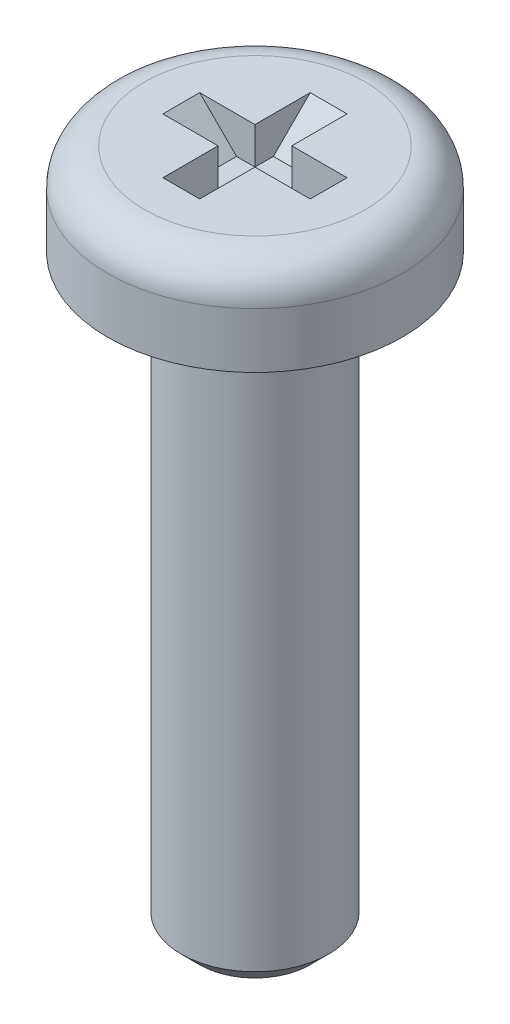
ISO-10303-21;
HEADER;
FILE_DESCRIPTION(('STEP AP214'),'2;1');
FILE_NAME('part.step','',(''),(''),'','','');
FILE_SCHEMA(('AUTOMOTIVE_DESIGN { 1 0 10303 214 1 1 1 1 }'));
ENDSEC;
DATA;
#1=APPLICATION_CONTEXT('core data for automotive mechanical design processes');
#2=APPLICATION_PROTOCOL_DEFINITION('international standard','automotive_design',2000,#1);
#3=PRODUCT_CONTEXT('',#1,'mechanical');
#4=PRODUCT('Part','Part','',(#3));
#5=PRODUCT_RELATED_PRODUCT_CATEGORY('part','',(#4));
#6=PRODUCT_DEFINITION_FORMATION('','',#4);
#7=PRODUCT_DEFINITION_CONTEXT('part definition',#1,'design');
#8=PRODUCT_DEFINITION('design','',#6,#7);
#9=PRODUCT_DEFINITION_SHAPE('','',#8);
#10=(LENGTH_UNIT() NAMED_UNIT(*) SI_UNIT(.MILLI.,.METRE.));
#11=(NAMED_UNIT(*) PLANE_ANGLE_UNIT() SI_UNIT($,.RADIAN.));
#12=(NAMED_UNIT(*) SI_UNIT($,.STERADIAN.) SOLID_ANGLE_UNIT());
#13=UNCERTAINTY_MEASURE_WITH_UNIT(LENGTH_MEASURE(1.E-05),#10,'distance_accuracy_value','');
#14=(GEOMETRIC_REPRESENTATION_CONTEXT(3) GLOBAL_UNCERTAINTY_ASSIGNED_CONTEXT((#13)) GLOBAL_UNIT_ASSIGNED_CONTEXT((#10,
#11,#12)) REPRESENTATION_CONTEXT('',''));
#15=CARTESIAN_POINT('',(0.,0.,0.));
#16=DIRECTION('',(0.,0.,1.));
#17=DIRECTION('',(1.,0.,0.));
#18=AXIS2_PLACEMENT_3D('',#15,#16,#17);
#19=CARTESIAN_POINT('',(0.,16.,0.));
#20=DIRECTION('',(0.,-1.,0.));
#21=DIRECTION('',(0.,0.,-1.));
#22=AXIS2_PLACEMENT_3D('',#19,#20,#21);
#23=CYLINDRICAL_SURFACE('',#22,2.);
#24=CARTESIAN_POINT('',(0.,0.500000000000002,0.));
#25=DIRECTION('',(0.,1.,0.));
#26=DIRECTION('',(0.,0.,1.));
#27=AXIS2_PLACEMENT_3D('',#24,#25,#26);
#28=CIRCLE('',#27,2.);
#29=CARTESIAN_POINT('',(0.,0.500000000000002,2.));
#30=VERTEX_POINT('',#29);
#31=EDGE_CURVE('E245',#30,#30,#28,.T.);
#32=ORIENTED_EDGE('',*,*,#31,.T.);
#33=EDGE_LOOP('',(#32));
#34=FACE_BOUND('',#33,.T.);
#35=CARTESIAN_POINT('',(0.,16.,0.));
#36=DIRECTION('',(0.,1.,0.));
#37=DIRECTION('',(0.,0.,1.));
#38=AXIS2_PLACEMENT_3D('',#35,#36,#37);
#39=CIRCLE('',#38,2.);
#40=CARTESIAN_POINT('',(0.,16.,2.));
#41=VERTEX_POINT('',#40);
#42=EDGE_CURVE('E231',#41,#41,#39,.T.);
#43=ORIENTED_EDGE('',*,*,#42,.F.);
#44=EDGE_LOOP('',(#43));
#45=FACE_BOUND('',#44,.T.);
#46=ADVANCED_FACE('F69',(#34,#45),#23,.T.);
#47=CARTESIAN_POINT('',(0.,0.,0.));
#48=DIRECTION('',(0.,1.,0.));
#49=DIRECTION('',(0.,0.,1.));
#50=AXIS2_PLACEMENT_3D('',#47,#48,#49);
#51=PLANE('',#50);
#52=CARTESIAN_POINT('',(0.,0.,0.));
#53=DIRECTION('',(0.,1.,0.));
#54=DIRECTION('',(0.,0.,1.));
#55=AXIS2_PLACEMENT_3D('',#52,#53,#54);
#56=CIRCLE('',#55,1.49999999999999);
#57=CARTESIAN_POINT('',(0.,0.,1.49999999999999));
#58=VERTEX_POINT('',#57);
#59=EDGE_CURVE('E241',#58,#58,#56,.F.);
#60=ORIENTED_EDGE('',*,*,#59,.T.);
#61=EDGE_LOOP('',(#60));
#62=FACE_BOUND('',#61,.T.);
#63=ADVANCED_FACE('F309',(#62),#51,.F.);
#64=CARTESIAN_POINT('',(0.,18.5,0.));
#65=DIRECTION('',(0.,-1.,0.));
#66=DIRECTION('',(0.,0.,-1.));
#67=AXIS2_PLACEMENT_3D('',#64,#65,#66);
#68=CYLINDRICAL_SURFACE('',#67,4.);
#69=CARTESIAN_POINT('',(0.,17.5,0.));
#70=DIRECTION('',(0.,1.,0.));
#71=DIRECTION('',(0.,0.,1.));
#72=AXIS2_PLACEMENT_3D('',#69,#70,#71);
#73=CIRCLE('',#72,4.);
#74=CARTESIAN_POINT('',(0.,17.5,4.));
#75=VERTEX_POINT('',#74);
#76=EDGE_CURVE('E239',#75,#75,#73,.F.);
#77=ORIENTED_EDGE('',*,*,#76,.T.);
#78=EDGE_LOOP('',(#77));
#79=FACE_BOUND('',#78,.T.);
#80=CARTESIAN_POINT('',(0.,16.,0.));
#81=DIRECTION('',(0.,1.,0.));
#82=DIRECTION('',(0.,0.,1.));
#83=AXIS2_PLACEMENT_3D('',#80,#81,#82);
#84=CIRCLE('',#83,4.);
#85=CARTESIAN_POINT('',(0.,16.,4.));
#86=VERTEX_POINT('',#85);
#87=EDGE_CURVE('E217',#86,#86,#84,.T.);
#88=ORIENTED_EDGE('',*,*,#87,.T.);
#89=EDGE_LOOP('',(#88));
#90=FACE_BOUND('',#89,.T.);
#91=ADVANCED_FACE('F316',(#79,#90),#68,.T.);
#92=CARTESIAN_POINT('',(0.,18.5,0.));
#93=DIRECTION('',(0.,1.,0.));
#94=DIRECTION('',(0.,0.,1.));
#95=AXIS2_PLACEMENT_3D('',#92,#93,#94);
#96=PLANE('',#95);
#97=DIRECTION('',(0.,0.,-1.));
#98=VECTOR('',#97,1.);
#99=CARTESIAN_POINT('',(-0.5,18.5,-2.));
#100=LINE('',#99,#98);
#101=CARTESIAN_POINT('',(-0.5,18.5,-2.));
#102=VERTEX_POINT('',#101);
#103=CARTESIAN_POINT('',(-0.5,18.5,-0.5));
#104=VERTEX_POINT('',#103);
#105=EDGE_CURVE('E190',#102,#104,#100,.F.);
#106=ORIENTED_EDGE('',*,*,#105,.F.);
#107=DIRECTION('',(1.,0.,0.));
#108=VECTOR('',#107,1.);
#109=CARTESIAN_POINT('',(-0.5,18.5,-2.));
#110=LINE('',#109,#108);
#111=CARTESIAN_POINT('',(0.5,18.5,-2.));
#112=VERTEX_POINT('',#111);
#113=EDGE_CURVE('E192',#102,#112,#110,.T.);
#114=ORIENTED_EDGE('',*,*,#113,.T.);
#115=DIRECTION('',(0.,0.,-1.));
#116=VECTOR('',#115,1.);
#117=CARTESIAN_POINT('',(0.5,18.5,-2.));
#118=LINE('',#117,#116);
#119=CARTESIAN_POINT('',(0.5,18.5,-0.5));
#120=VERTEX_POINT('',#119);
#121=EDGE_CURVE('E185',#112,#120,#118,.F.);
#122=ORIENTED_EDGE('',*,*,#121,.T.);
#123=DIRECTION('',(1.,0.,0.));
#124=VECTOR('',#123,1.);
#125=CARTESIAN_POINT('',(-2.,18.5,-0.5));
#126=LINE('',#125,#124);
#127=CARTESIAN_POINT('',(2.,18.5,-0.500000000000001));
#128=VERTEX_POINT('',#127);
#129=EDGE_CURVE('E221',#120,#128,#126,.T.);
#130=ORIENTED_EDGE('',*,*,#129,.T.);
#131=DIRECTION('',(0.,0.,1.));
#132=VECTOR('',#131,1.);
#133=CARTESIAN_POINT('',(2.,18.5,-0.500000000000001));
#134=LINE('',#133,#132);
#135=CARTESIAN_POINT('',(2.,18.5,0.499999999999999));
#136=VERTEX_POINT('',#135);
#137=EDGE_CURVE('E225',#128,#136,#134,.T.);
#138=ORIENTED_EDGE('',*,*,#137,.T.);
#139=DIRECTION('',(1.,0.,0.));
#140=VECTOR('',#139,1.);
#141=CARTESIAN_POINT('',(-2.,18.5,0.5));
#142=LINE('',#141,#140);
#143=CARTESIAN_POINT('',(0.5,18.5,0.5));
#144=VERTEX_POINT('',#143);
#145=EDGE_CURVE('E182',#144,#136,#142,.T.);
#146=ORIENTED_EDGE('',*,*,#145,.F.);
#147=CARTESIAN_POINT('',(0.5,18.5,2.));
#148=VERTEX_POINT('',#147);
#149=EDGE_CURVE('E165',#144,#148,#118,.F.);
#150=ORIENTED_EDGE('',*,*,#149,.T.);
#151=DIRECTION('',(-1.,0.,0.));
#152=VECTOR('',#151,1.);
#153=CARTESIAN_POINT('',(0.5,18.5,2.));
#154=LINE('',#153,#152);
#155=CARTESIAN_POINT('',(-0.5,18.5,2.));
#156=VERTEX_POINT('',#155);
#157=EDGE_CURVE('E176',#148,#156,#154,.T.);
#158=ORIENTED_EDGE('',*,*,#157,.T.);
#159=CARTESIAN_POINT('',(-0.5,18.5,0.5));
#160=VERTEX_POINT('',#159);
#161=EDGE_CURVE('E186',#160,#156,#100,.F.);
#162=ORIENTED_EDGE('',*,*,#161,.F.);
#163=CARTESIAN_POINT('',(-2.,18.5,0.5));
#164=VERTEX_POINT('',#163);
#165=EDGE_CURVE('E218',#164,#160,#142,.T.);
#166=ORIENTED_EDGE('',*,*,#165,.F.);
#167=DIRECTION('',(0.,0.,-1.));
#168=VECTOR('',#167,1.);
#169=CARTESIAN_POINT('',(-2.,18.5,0.5));
#170=LINE('',#169,#168);
#171=CARTESIAN_POINT('',(-2.,18.5,-0.5));
#172=VERTEX_POINT('',#171);
#173=EDGE_CURVE('E228',#164,#172,#170,.T.);
#174=ORIENTED_EDGE('',*,*,#173,.T.);
#175=EDGE_CURVE('E223',#172,#104,#126,.T.);
#176=ORIENTED_EDGE('',*,*,#175,.T.);
#177=EDGE_LOOP('',(#106,#114,#122,#130,#138,#146,#150,#158,#162,#166,#174,#176));
#178=FACE_BOUND('',#177,.T.);
#179=CARTESIAN_POINT('',(0.,18.5,0.));
#180=DIRECTION('',(0.,1.,0.));
#181=DIRECTION('',(0.,0.,1.));
#182=AXIS2_PLACEMENT_3D('',#179,#180,#181);
#183=CIRCLE('',#182,3.);
#184=CARTESIAN_POINT('',(0.,18.5,3.));
#185=VERTEX_POINT('',#184);
#186=EDGE_CURVE('E237',#185,#185,#183,.T.);
#187=ORIENTED_EDGE('',*,*,#186,.T.);
#188=EDGE_LOOP('',(#187));
#189=FACE_BOUND('',#188,.T.);
#190=ADVANCED_FACE('F171',(#178,#189),#96,.T.);
#191=CARTESIAN_POINT('',(0.,16.,0.));
#192=DIRECTION('',(0.,1.,0.));
#193=DIRECTION('',(0.,0.,1.));
#194=AXIS2_PLACEMENT_3D('',#191,#192,#193);
#195=PLANE('',#194);
#196=ORIENTED_EDGE('',*,*,#42,.T.);
#197=EDGE_LOOP('',(#196));
#198=FACE_BOUND('',#197,.T.);
#199=ORIENTED_EDGE('',*,*,#87,.F.);
#200=EDGE_LOOP('',(#199));
#201=FACE_BOUND('',#200,.T.);
#202=ADVANCED_FACE('F323',(#198,#201),#195,.F.);
#203=CARTESIAN_POINT('',(0.,17.5,0.));
#204=DIRECTION('',(0.,1.,0.));
#205=DIRECTION('',(0.,0.,1.));
#206=AXIS2_PLACEMENT_3D('',#203,#204,#205);
#207=TOROIDAL_SURFACE('',#206,3.,1.);
#208=ORIENTED_EDGE('',*,*,#76,.F.);
#209=EDGE_LOOP('',(#208));
#210=FACE_BOUND('',#209,.T.);
#211=ORIENTED_EDGE('',*,*,#186,.F.);
#212=EDGE_LOOP('',(#211));
#213=FACE_BOUND('',#212,.T.);
#214=ADVANCED_FACE('F304',(#210,#213),#207,.T.);
#215=CARTESIAN_POINT('',(0.,0.500000000000002,0.));
#216=DIRECTION('',(0.,1.,0.));
#217=DIRECTION('',(0.,0.,1.));
#218=AXIS2_PLACEMENT_3D('',#215,#216,#217);
#219=CONICAL_SURFACE('',#218,2.,0.785398163397452);
#220=ORIENTED_EDGE('',*,*,#59,.F.);
#221=EDGE_LOOP('',(#220));
#222=FACE_BOUND('',#221,.T.);
#223=ORIENTED_EDGE('',*,*,#31,.F.);
#224=EDGE_LOOP('',(#223));
#225=FACE_BOUND('',#224,.T.);
#226=ADVANCED_FACE('F297',(#222,#225),#219,.T.);
#227=CARTESIAN_POINT('',(-2.,17.5,0.5));
#228=DIRECTION('',(0.,0.,1.));
#229=DIRECTION('',(1.,0.,0.));
#230=AXIS2_PLACEMENT_3D('',#227,#228,#229);
#231=PLANE('',#230);
#232=ORIENTED_EDGE('',*,*,#145,.T.);
#233=DIRECTION('',(-0.707106781186544,-0.707106781186551,0.));
#234=VECTOR('',#233,1.);
#235=CARTESIAN_POINT('',(2.,18.5,0.499999999999999));
#236=LINE('',#235,#234);
#237=CARTESIAN_POINT('',(1.,17.5,0.5));
#238=VERTEX_POINT('',#237);
#239=EDGE_CURVE('E169',#136,#238,#236,.T.);
#240=ORIENTED_EDGE('',*,*,#239,.T.);
#241=DIRECTION('',(1.,0.,0.));
#242=VECTOR('',#241,1.);
#243=CARTESIAN_POINT('',(-2.,17.5,0.5));
#244=LINE('',#243,#242);
#245=CARTESIAN_POINT('',(0.5,17.5,0.5));
#246=VERTEX_POINT('',#245);
#247=EDGE_CURVE('E212',#246,#238,#244,.T.);
#248=ORIENTED_EDGE('',*,*,#247,.F.);
#249=DIRECTION('',(0.,-1.,0.));
#250=VECTOR('',#249,1.);
#251=CARTESIAN_POINT('',(0.5,17.5,0.5));
#252=LINE('',#251,#250);
#253=EDGE_CURVE('E205',#144,#246,#252,.T.);
#254=ORIENTED_EDGE('',*,*,#253,.F.);
#255=EDGE_LOOP('',(#232,#240,#248,#254));
#256=FACE_BOUND('',#255,.T.);
#257=ADVANCED_FACE('F294',(#256),#231,.F.);
#258=CARTESIAN_POINT('',(-2.,17.5,-0.5));
#259=DIRECTION('',(0.,0.,1.));
#260=DIRECTION('',(1.,0.,0.));
#261=AXIS2_PLACEMENT_3D('',#258,#259,#260);
#262=PLANE('',#261);
#263=DIRECTION('',(1.,0.,0.));
#264=VECTOR('',#263,1.);
#265=CARTESIAN_POINT('',(-2.,17.5,-0.5));
#266=LINE('',#265,#264);
#267=CARTESIAN_POINT('',(0.5,17.5,-0.5));
#268=VERTEX_POINT('',#267);
#269=CARTESIAN_POINT('',(1.,17.5,-0.5));
#270=VERTEX_POINT('',#269);
#271=EDGE_CURVE('E213',#268,#270,#266,.T.);
#272=ORIENTED_EDGE('',*,*,#271,.T.);
#273=DIRECTION('',(0.707106781186544,0.707106781186551,0.));
#274=VECTOR('',#273,1.);
#275=CARTESIAN_POINT('',(-0.499999999999985,16.,-0.5));
#276=LINE('',#275,#274);
#277=EDGE_CURVE('E258',#270,#128,#276,.T.);
#278=ORIENTED_EDGE('',*,*,#277,.T.);
#279=ORIENTED_EDGE('',*,*,#129,.F.);
#280=DIRECTION('',(0.,-1.,0.));
#281=VECTOR('',#280,1.);
#282=CARTESIAN_POINT('',(0.5,17.5,-0.5));
#283=LINE('',#282,#281);
#284=EDGE_CURVE('E200',#120,#268,#283,.T.);
#285=ORIENTED_EDGE('',*,*,#284,.T.);
#286=EDGE_LOOP('',(#272,#278,#279,#285));
#287=FACE_BOUND('',#286,.T.);
#288=ADVANCED_FACE('F290',(#287),#262,.T.);
#289=CARTESIAN_POINT('',(-1.,17.5,0.5));
#290=VERTEX_POINT('',#289);
#291=CARTESIAN_POINT('',(-0.5,17.5,0.5));
#292=VERTEX_POINT('',#291);
#293=EDGE_CURVE('E211',#290,#292,#244,.T.);
#294=ORIENTED_EDGE('',*,*,#293,.F.);
#295=DIRECTION('',(-0.707106781186544,0.707106781186551,0.));
#296=VECTOR('',#295,1.);
#297=CARTESIAN_POINT('',(-2.,18.5,0.5));
#298=LINE('',#297,#296);
#299=EDGE_CURVE('E12',#290,#164,#298,.T.);
#300=ORIENTED_EDGE('',*,*,#299,.T.);
#301=ORIENTED_EDGE('',*,*,#165,.T.);
#302=DIRECTION('',(0.,-1.,0.));
#303=VECTOR('',#302,1.);
#304=CARTESIAN_POINT('',(-0.5,17.5,0.5));
#305=LINE('',#304,#303);
#306=EDGE_CURVE('E208',#160,#292,#305,.T.);
#307=ORIENTED_EDGE('',*,*,#306,.T.);
#308=EDGE_LOOP('',(#294,#300,#301,#307));
#309=FACE_BOUND('',#308,.T.);
#310=ADVANCED_FACE('F273',(#309),#231,.F.);
#311=ORIENTED_EDGE('',*,*,#175,.F.);
#312=DIRECTION('',(0.707106781186544,-0.707106781186551,0.));
#313=VECTOR('',#312,1.);
#314=CARTESIAN_POINT('',(-1.5,18.,-0.5));
#315=LINE('',#314,#313);
#316=CARTESIAN_POINT('',(-1.,17.5,-0.5));
#317=VERTEX_POINT('',#316);
#318=EDGE_CURVE('E78',#172,#317,#315,.T.);
#319=ORIENTED_EDGE('',*,*,#318,.T.);
#320=CARTESIAN_POINT('',(-0.5,17.5,-0.5));
#321=VERTEX_POINT('',#320);
#322=EDGE_CURVE('E214',#317,#321,#266,.T.);
#323=ORIENTED_EDGE('',*,*,#322,.T.);
#324=DIRECTION('',(0.,-1.,0.));
#325=VECTOR('',#324,1.);
#326=CARTESIAN_POINT('',(-0.5,17.5,-0.5));
#327=LINE('',#326,#325);
#328=EDGE_CURVE('E202',#104,#321,#327,.T.);
#329=ORIENTED_EDGE('',*,*,#328,.F.);
#330=EDGE_LOOP('',(#311,#319,#323,#329));
#331=FACE_BOUND('',#330,.T.);
#332=ADVANCED_FACE('F263',(#331),#262,.T.);
#333=CARTESIAN_POINT('',(0.,17.5,0.));
#334=DIRECTION('',(0.,-1.,0.));
#335=DIRECTION('',(-1.,0.,0.));
#336=AXIS2_PLACEMENT_3D('',#333,#334,#335);
#337=PLANE('',#336);
#338=DIRECTION('',(0.,0.,-1.));
#339=VECTOR('',#338,1.);
#340=CARTESIAN_POINT('',(-0.5,17.5,-2.));
#341=LINE('',#340,#339);
#342=CARTESIAN_POINT('',(-0.5,17.5,1.));
#343=VERTEX_POINT('',#342);
#344=EDGE_CURVE('E196',#292,#343,#341,.F.);
#345=ORIENTED_EDGE('',*,*,#344,.T.);
#346=DIRECTION('',(1.,0.,0.));
#347=VECTOR('',#346,1.);
#348=CARTESIAN_POINT('',(0.,17.5,1.));
#349=LINE('',#348,#347);
#350=CARTESIAN_POINT('',(0.5,17.5,1.));
#351=VERTEX_POINT('',#350);
#352=EDGE_CURVE('E166',#343,#351,#349,.T.);
#353=ORIENTED_EDGE('',*,*,#352,.T.);
#354=DIRECTION('',(0.,0.,-1.));
#355=VECTOR('',#354,1.);
#356=CARTESIAN_POINT('',(0.5,17.5,-2.));
#357=LINE('',#356,#355);
#358=EDGE_CURVE('E163',#246,#351,#357,.F.);
#359=ORIENTED_EDGE('',*,*,#358,.F.);
#360=ORIENTED_EDGE('',*,*,#247,.T.);
#361=DIRECTION('',(0.,0.,-1.));
#362=VECTOR('',#361,1.);
#363=CARTESIAN_POINT('',(1.,17.5,0.));
#364=LINE('',#363,#362);
#365=EDGE_CURVE('E252',#238,#270,#364,.T.);
#366=ORIENTED_EDGE('',*,*,#365,.T.);
#367=ORIENTED_EDGE('',*,*,#271,.F.);
#368=CARTESIAN_POINT('',(0.5,17.5,-1.));
#369=VERTEX_POINT('',#368);
#370=EDGE_CURVE('E201',#369,#268,#357,.F.);
#371=ORIENTED_EDGE('',*,*,#370,.F.);
#372=DIRECTION('',(-1.,0.,0.));
#373=VECTOR('',#372,1.);
#374=CARTESIAN_POINT('',(0.,17.5,-1.));
#375=LINE('',#374,#373);
#376=CARTESIAN_POINT('',(-0.5,17.5,-1.));
#377=VERTEX_POINT('',#376);
#378=EDGE_CURVE('E82',#369,#377,#375,.T.);
#379=ORIENTED_EDGE('',*,*,#378,.T.);
#380=EDGE_CURVE('E269',#377,#321,#341,.F.);
#381=ORIENTED_EDGE('',*,*,#380,.T.);
#382=ORIENTED_EDGE('',*,*,#322,.F.);
#383=DIRECTION('',(0.,0.,1.));
#384=VECTOR('',#383,1.);
#385=CARTESIAN_POINT('',(-1.,17.5,0.));
#386=LINE('',#385,#384);
#387=EDGE_CURVE('E249',#317,#290,#386,.T.);
#388=ORIENTED_EDGE('',*,*,#387,.T.);
#389=ORIENTED_EDGE('',*,*,#293,.T.);
#390=EDGE_LOOP('',(#345,#353,#359,#360,#366,#367,#371,#379,#381,#382,#388,#389));
#391=FACE_BOUND('',#390,.T.);
#392=ADVANCED_FACE('F268',(#391),#337,.F.);
#393=CARTESIAN_POINT('',(0.5,17.5,-2.));
#394=DIRECTION('',(-1.,0.,0.));
#395=DIRECTION('',(0.,0.,1.));
#396=AXIS2_PLACEMENT_3D('',#393,#394,#395);
#397=PLANE('',#396);
#398=ORIENTED_EDGE('',*,*,#121,.F.);
#399=DIRECTION('',(0.,-0.707106781186551,0.707106781186544));
#400=VECTOR('',#399,1.);
#401=CARTESIAN_POINT('',(0.5,18.,-1.5));
#402=LINE('',#401,#400);
#403=EDGE_CURVE('E91',#112,#369,#402,.T.);
#404=ORIENTED_EDGE('',*,*,#403,.T.);
#405=ORIENTED_EDGE('',*,*,#370,.T.);
#406=ORIENTED_EDGE('',*,*,#284,.F.);
#407=EDGE_LOOP('',(#398,#404,#405,#406));
#408=FACE_BOUND('',#407,.T.);
#409=ADVANCED_FACE('F282',(#408),#397,.T.);
#410=CARTESIAN_POINT('',(-0.5,17.5,-2.));
#411=DIRECTION('',(-1.,0.,0.));
#412=DIRECTION('',(0.,0.,1.));
#413=AXIS2_PLACEMENT_3D('',#410,#411,#412);
#414=PLANE('',#413);
#415=ORIENTED_EDGE('',*,*,#380,.F.);
#416=DIRECTION('',(0.,0.707106781186551,-0.707106781186544));
#417=VECTOR('',#416,1.);
#418=CARTESIAN_POINT('',(-0.5,18.5,-2.));
#419=LINE('',#418,#417);
#420=EDGE_CURVE('E259',#377,#102,#419,.T.);
#421=ORIENTED_EDGE('',*,*,#420,.T.);
#422=ORIENTED_EDGE('',*,*,#105,.T.);
#423=ORIENTED_EDGE('',*,*,#328,.T.);
#424=EDGE_LOOP('',(#415,#421,#422,#423));
#425=FACE_BOUND('',#424,.T.);
#426=ADVANCED_FACE('F348',(#425),#414,.F.);
#427=ORIENTED_EDGE('',*,*,#161,.T.);
#428=DIRECTION('',(0.,-0.707106781186551,-0.707106781186544));
#429=VECTOR('',#428,1.);
#430=CARTESIAN_POINT('',(-0.5,18.5,2.));
#431=LINE('',#430,#429);
#432=EDGE_CURVE('E183',#156,#343,#431,.T.);
#433=ORIENTED_EDGE('',*,*,#432,.T.);
#434=ORIENTED_EDGE('',*,*,#344,.F.);
#435=ORIENTED_EDGE('',*,*,#306,.F.);
#436=EDGE_LOOP('',(#427,#433,#434,#435));
#437=FACE_BOUND('',#436,.T.);
#438=ADVANCED_FACE('F277',(#437),#414,.F.);
#439=ORIENTED_EDGE('',*,*,#358,.T.);
#440=DIRECTION('',(0.,0.707106781186551,0.707106781186544));
#441=VECTOR('',#440,1.);
#442=CARTESIAN_POINT('',(0.5,16.,-0.499999999999985));
#443=LINE('',#442,#441);
#444=EDGE_CURVE('E158',#351,#148,#443,.T.);
#445=ORIENTED_EDGE('',*,*,#444,.T.);
#446=ORIENTED_EDGE('',*,*,#149,.F.);
#447=ORIENTED_EDGE('',*,*,#253,.T.);
#448=EDGE_LOOP('',(#439,#445,#446,#447));
#449=FACE_BOUND('',#448,.T.);
#450=ADVANCED_FACE('F159',(#449),#397,.T.);
#451=CARTESIAN_POINT('',(0.5,18.5,2.));
#452=DIRECTION('',(0.,-0.707106781186544,0.707106781186551));
#453=DIRECTION('',(-1.,0.,0.));
#454=AXIS2_PLACEMENT_3D('',#451,#452,#453);
#455=PLANE('',#454);
#456=ORIENTED_EDGE('',*,*,#444,.F.);
#457=ORIENTED_EDGE('',*,*,#352,.F.);
#458=ORIENTED_EDGE('',*,*,#432,.F.);
#459=ORIENTED_EDGE('',*,*,#157,.F.);
#460=EDGE_LOOP('',(#456,#457,#458,#459));
#461=FACE_BOUND('',#460,.T.);
#462=ADVANCED_FACE('F184',(#461),#455,.F.);
#463=CARTESIAN_POINT('',(2.,18.5,-0.500000000000001));
#464=DIRECTION('',(0.707106781186551,-0.707106781186544,0.));
#465=DIRECTION('',(0.,0.,1.));
#466=AXIS2_PLACEMENT_3D('',#463,#464,#465);
#467=PLANE('',#466);
#468=ORIENTED_EDGE('',*,*,#277,.F.);
#469=ORIENTED_EDGE('',*,*,#365,.F.);
#470=ORIENTED_EDGE('',*,*,#239,.F.);
#471=ORIENTED_EDGE('',*,*,#137,.F.);
#472=EDGE_LOOP('',(#468,#469,#470,#471));
#473=FACE_BOUND('',#472,.T.);
#474=ADVANCED_FACE('F292',(#473),#467,.F.);
#475=CARTESIAN_POINT('',(-0.5,18.5,-2.));
#476=DIRECTION('',(0.,-0.707106781186544,-0.707106781186551));
#477=DIRECTION('',(1.,0.,0.));
#478=AXIS2_PLACEMENT_3D('',#475,#476,#477);
#479=PLANE('',#478);
#480=ORIENTED_EDGE('',*,*,#420,.F.);
#481=ORIENTED_EDGE('',*,*,#378,.F.);
#482=ORIENTED_EDGE('',*,*,#403,.F.);
#483=ORIENTED_EDGE('',*,*,#113,.F.);
#484=EDGE_LOOP('',(#480,#481,#482,#483));
#485=FACE_BOUND('',#484,.T.);
#486=ADVANCED_FACE('F339',(#485),#479,.F.);
#487=CARTESIAN_POINT('',(-2.,18.5,0.5));
#488=DIRECTION('',(-0.707106781186551,-0.707106781186544,0.));
#489=DIRECTION('',(0.,0.,-1.));
#490=AXIS2_PLACEMENT_3D('',#487,#488,#489);
#491=PLANE('',#490);
#492=ORIENTED_EDGE('',*,*,#299,.F.);
#493=ORIENTED_EDGE('',*,*,#387,.F.);
#494=ORIENTED_EDGE('',*,*,#318,.F.);
#495=ORIENTED_EDGE('',*,*,#173,.F.);
#496=EDGE_LOOP('',(#492,#493,#494,#495));
#497=FACE_BOUND('',#496,.T.);
#498=ADVANCED_FACE('F75',(#497),#491,.F.);
#499=CLOSED_SHELL('',(#46,#63,#91,#190,#202,#214,#226,#257,#288,#310,#332,#392,#409,#426,#438,
#450,#462,#474,#486,#498));
#500=MANIFOLD_SOLID_BREP('B2',#499);
#501=ADVANCED_BREP_SHAPE_REPRESENTATION('',(#18,#500),#14);
#502=SHAPE_DEFINITION_REPRESENTATION(#9,#501);
ENDSEC;
END-ISO-10303-21;
